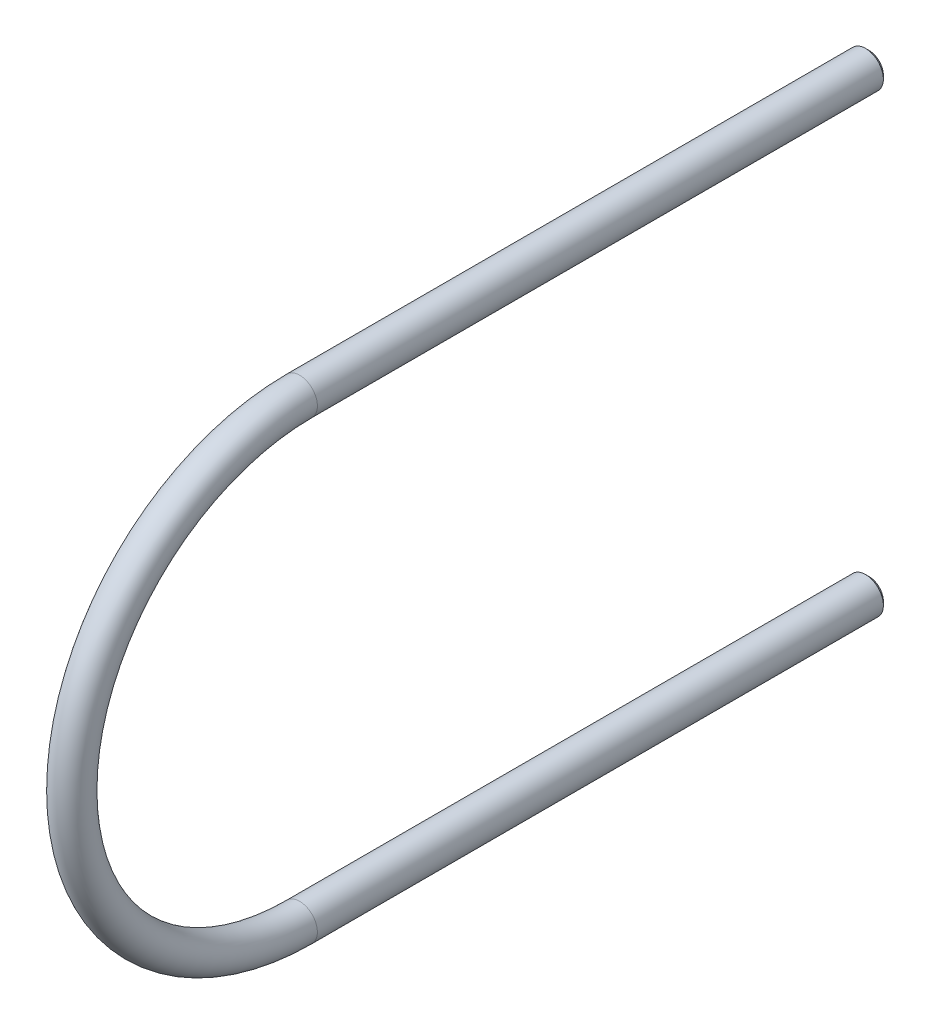
ISO-10303-21;
HEADER;
FILE_DESCRIPTION(('STEP AP214'),'2;1');
FILE_NAME('part.step','',(''),(''),'','','');
FILE_SCHEMA(('AUTOMOTIVE_DESIGN { 1 0 10303 214 1 1 1 1 }'));
ENDSEC;
DATA;
#1=APPLICATION_CONTEXT('core data for automotive mechanical design processes');
#2=APPLICATION_PROTOCOL_DEFINITION('international standard','automotive_design',2000,#1);
#3=PRODUCT_CONTEXT('',#1,'mechanical');
#4=PRODUCT('Part','Part','',(#3));
#5=PRODUCT_RELATED_PRODUCT_CATEGORY('part','',(#4));
#6=PRODUCT_DEFINITION_FORMATION('','',#4);
#7=PRODUCT_DEFINITION_CONTEXT('part definition',#1,'design');
#8=PRODUCT_DEFINITION('design','',#6,#7);
#9=PRODUCT_DEFINITION_SHAPE('','',#8);
#10=(LENGTH_UNIT() NAMED_UNIT(*) SI_UNIT(.MILLI.,.METRE.));
#11=(NAMED_UNIT(*) PLANE_ANGLE_UNIT() SI_UNIT($,.RADIAN.));
#12=(NAMED_UNIT(*) SI_UNIT($,.STERADIAN.) SOLID_ANGLE_UNIT());
#13=UNCERTAINTY_MEASURE_WITH_UNIT(LENGTH_MEASURE(1.E-05),#10,'distance_accuracy_value','');
#14=(GEOMETRIC_REPRESENTATION_CONTEXT(3) GLOBAL_UNCERTAINTY_ASSIGNED_CONTEXT((#13)) GLOBAL_UNIT_ASSIGNED_CONTEXT((#10,
#11,#12)) REPRESENTATION_CONTEXT('',''));
#15=CARTESIAN_POINT('',(0.,0.,0.));
#16=DIRECTION('',(0.,0.,1.));
#17=DIRECTION('',(1.,0.,0.));
#18=AXIS2_PLACEMENT_3D('',#15,#16,#17);
#19=CARTESIAN_POINT('',(0.,0.,0.));
#20=DIRECTION('',(-1.,0.,0.));
#21=DIRECTION('',(0.,0.,1.));
#22=AXIS2_PLACEMENT_3D('',#19,#20,#21);
#23=TOROIDAL_SURFACE('',#22,32.,2.5);
#24=CARTESIAN_POINT('',(0.,-32.,-2.23454805685961E-13));
#25=DIRECTION('',(0.,0.,-1.));
#26=DIRECTION('',(1.,0.,0.));
#27=AXIS2_PLACEMENT_3D('',#24,#25,#26);
#28=CIRCLE('',#27,2.5);
#29=CARTESIAN_POINT('',(0.,-34.5,-2.40912212380176E-13));
#30=VERTEX_POINT('',#29);
#31=EDGE_CURVE('E70',#30,#30,#28,.T.);
#32=CARTESIAN_POINT('',(0.,32.,0.));
#33=DIRECTION('',(0.,0.,1.));
#34=DIRECTION('',(1.,0.,0.));
#35=AXIS2_PLACEMENT_3D('',#32,#33,#34);
#36=CIRCLE('',#35,2.5);
#37=CARTESIAN_POINT('',(0.,34.5,0.));
#38=VERTEX_POINT('',#37);
#39=EDGE_CURVE('E74',#38,#38,#36,.T.);
#40=CARTESIAN_POINT('',(0.,0.,0.));
#41=DIRECTION('',(-1.,0.,0.));
#42=DIRECTION('',(0.,0.,1.));
#43=AXIS2_PLACEMENT_3D('',#40,#41,#42);
#44=CIRCLE('',#43,34.5);
#45=EDGE_CURVE('',#30,#38,#44,.T.);
#46=ORIENTED_EDGE('',*,*,#31,.F.);
#47=ORIENTED_EDGE('',*,*,#39,.T.);
#48=ORIENTED_EDGE('',*,*,#45,.T.);
#49=ORIENTED_EDGE('',*,*,#45,.F.);
#50=EDGE_LOOP('',(#46,#48,#47,#49));
#51=FACE_BOUND('',#50,.T.);
#52=ADVANCED_FACE('F45',(#51),#23,.T.);
#53=CARTESIAN_POINT('',(0.,32.,-80.));
#54=DIRECTION('',(0.,0.,1.));
#55=DIRECTION('',(1.,0.,0.));
#56=AXIS2_PLACEMENT_3D('',#53,#54,#55);
#57=CYLINDRICAL_SURFACE('',#56,2.5);
#58=CARTESIAN_POINT('',(0.,32.,-79.5));
#59=DIRECTION('',(0.,0.,1.));
#60=DIRECTION('',(1.,0.,0.));
#61=AXIS2_PLACEMENT_3D('',#58,#59,#60);
#62=CIRCLE('',#61,2.5);
#63=CARTESIAN_POINT('',(2.5,32.,-79.5));
#64=VERTEX_POINT('',#63);
#65=EDGE_CURVE('E54',#64,#64,#62,.T.);
#66=ORIENTED_EDGE('',*,*,#65,.T.);
#67=EDGE_LOOP('',(#66));
#68=FACE_BOUND('',#67,.T.);
#69=ORIENTED_EDGE('',*,*,#39,.F.);
#70=EDGE_LOOP('',(#69));
#71=FACE_BOUND('',#70,.T.);
#72=ADVANCED_FACE('F80',(#68,#71),#57,.T.);
#73=CARTESIAN_POINT('',(0.,32.,-80.));
#74=DIRECTION('',(0.,0.,1.));
#75=DIRECTION('',(1.,0.,0.));
#76=AXIS2_PLACEMENT_3D('',#73,#74,#75);
#77=PLANE('',#76);
#78=CARTESIAN_POINT('',(0.,32.,-80.));
#79=DIRECTION('',(0.,0.,1.));
#80=DIRECTION('',(1.,0.,0.));
#81=AXIS2_PLACEMENT_3D('',#78,#79,#80);
#82=CIRCLE('',#81,2.00000000000002);
#83=CARTESIAN_POINT('',(2.00000000000002,32.,-80.));
#84=VERTEX_POINT('',#83);
#85=EDGE_CURVE('E10',#84,#84,#82,.F.);
#86=ORIENTED_EDGE('',*,*,#85,.T.);
#87=EDGE_LOOP('',(#86));
#88=FACE_BOUND('',#87,.T.);
#89=ADVANCED_FACE('F82',(#88),#77,.F.);
#90=CARTESIAN_POINT('',(0.,-31.9999999999994,-80.0000000000002));
#91=DIRECTION('',(0.,0.,1.));
#92=DIRECTION('',(0.,-1.,0.));
#93=AXIS2_PLACEMENT_3D('',#90,#91,#92);
#94=CYLINDRICAL_SURFACE('',#93,2.5);
#95=CARTESIAN_POINT('',(0.,-31.9999999999994,-79.5000000000002));
#96=DIRECTION('',(0.,0.,-1.));
#97=DIRECTION('',(0.,1.,0.));
#98=AXIS2_PLACEMENT_3D('',#95,#96,#97);
#99=CIRCLE('',#98,2.5);
#100=CARTESIAN_POINT('',(0.,-29.4999999999994,-79.5000000000002));
#101=VERTEX_POINT('',#100);
#102=EDGE_CURVE('E59',#101,#101,#99,.F.);
#103=ORIENTED_EDGE('',*,*,#102,.T.);
#104=EDGE_LOOP('',(#103));
#105=FACE_BOUND('',#104,.T.);
#106=ORIENTED_EDGE('',*,*,#31,.T.);
#107=EDGE_LOOP('',(#106));
#108=FACE_BOUND('',#107,.T.);
#109=ADVANCED_FACE('F88',(#105,#108),#94,.T.);
#110=CARTESIAN_POINT('',(0.,-31.9999999999994,-80.0000000000002));
#111=DIRECTION('',(0.,0.,-1.));
#112=DIRECTION('',(0.,1.,0.));
#113=AXIS2_PLACEMENT_3D('',#110,#111,#112);
#114=PLANE('',#113);
#115=CARTESIAN_POINT('',(0.,-31.9999999999994,-80.0000000000002));
#116=DIRECTION('',(0.,0.,-1.));
#117=DIRECTION('',(0.,1.,0.));
#118=AXIS2_PLACEMENT_3D('',#115,#116,#117);
#119=CIRCLE('',#118,1.99999999999997);
#120=CARTESIAN_POINT('',(0.,-29.9999999999995,-80.0000000000002));
#121=VERTEX_POINT('',#120);
#122=EDGE_CURVE('E64',#121,#121,#119,.T.);
#123=ORIENTED_EDGE('',*,*,#122,.T.);
#124=EDGE_LOOP('',(#123));
#125=FACE_BOUND('',#124,.T.);
#126=ADVANCED_FACE('F98',(#125),#114,.T.);
#127=CARTESIAN_POINT('',(0.,-31.9999999999994,-80.0000000000002));
#128=DIRECTION('',(0.,0.,1.));
#129=DIRECTION('',(0.,-1.,0.));
#130=AXIS2_PLACEMENT_3D('',#127,#128,#129);
#131=CONICAL_SURFACE('',#130,1.99999999999998,0.785398163397441);
#132=ORIENTED_EDGE('',*,*,#102,.F.);
#133=EDGE_LOOP('',(#132));
#134=FACE_BOUND('',#133,.T.);
#135=ORIENTED_EDGE('',*,*,#122,.F.);
#136=EDGE_LOOP('',(#135));
#137=FACE_BOUND('',#136,.T.);
#138=ADVANCED_FACE('F94',(#134,#137),#131,.T.);
#139=CARTESIAN_POINT('',(0.,32.,-79.5));
#140=DIRECTION('',(0.,0.,1.));
#141=DIRECTION('',(1.,0.,0.));
#142=AXIS2_PLACEMENT_3D('',#139,#140,#141);
#143=CONICAL_SURFACE('',#142,2.5,0.785398163397448);
#144=ORIENTED_EDGE('',*,*,#85,.F.);
#145=EDGE_LOOP('',(#144));
#146=FACE_BOUND('',#145,.T.);
#147=ORIENTED_EDGE('',*,*,#65,.F.);
#148=EDGE_LOOP('',(#147));
#149=FACE_BOUND('',#148,.T.);
#150=ADVANCED_FACE('F48',(#146,#149),#143,.T.);
#151=CLOSED_SHELL('',(#52,#72,#89,#109,#126,#138,#150));
#152=MANIFOLD_SOLID_BREP('B2',#151);
#153=ADVANCED_BREP_SHAPE_REPRESENTATION('',(#18,#152),#14);
#154=SHAPE_DEFINITION_REPRESENTATION(#9,#153);
ENDSEC;
END-ISO-10303-21;
